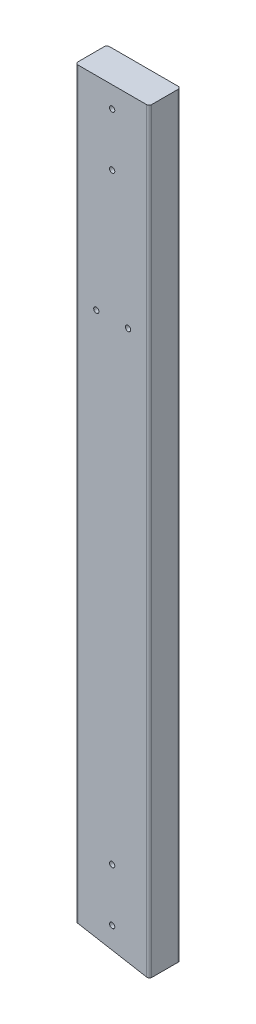
ISO-10303-21;
HEADER;
FILE_DESCRIPTION(('STEP AP214'),'2;1');
FILE_NAME('part.step','',(''),(''),'','','');
FILE_SCHEMA(('AUTOMOTIVE_DESIGN { 1 0 10303 214 1 1 1 1 }'));
ENDSEC;
DATA;
#1=APPLICATION_CONTEXT('core data for automotive mechanical design processes');
#2=APPLICATION_PROTOCOL_DEFINITION('international standard','automotive_design',2000,#1);
#3=PRODUCT_CONTEXT('',#1,'mechanical');
#4=PRODUCT('Part','Part','',(#3));
#5=PRODUCT_RELATED_PRODUCT_CATEGORY('part','',(#4));
#6=PRODUCT_DEFINITION_FORMATION('','',#4);
#7=PRODUCT_DEFINITION_CONTEXT('part definition',#1,'design');
#8=PRODUCT_DEFINITION('design','',#6,#7);
#9=PRODUCT_DEFINITION_SHAPE('','',#8);
#10=(LENGTH_UNIT() NAMED_UNIT(*) SI_UNIT(.MILLI.,.METRE.));
#11=(NAMED_UNIT(*) PLANE_ANGLE_UNIT() SI_UNIT($,.RADIAN.));
#12=(NAMED_UNIT(*) SI_UNIT($,.STERADIAN.) SOLID_ANGLE_UNIT());
#13=UNCERTAINTY_MEASURE_WITH_UNIT(LENGTH_MEASURE(1.E-05),#10,'distance_accuracy_value','');
#14=(GEOMETRIC_REPRESENTATION_CONTEXT(3) GLOBAL_UNCERTAINTY_ASSIGNED_CONTEXT((#13)) GLOBAL_UNIT_ASSIGNED_CONTEXT((#10,
#11,#12)) REPRESENTATION_CONTEXT('',''));
#15=CARTESIAN_POINT('',(0.,0.,0.));
#16=DIRECTION('',(0.,0.,1.));
#17=DIRECTION('',(1.,0.,0.));
#18=AXIS2_PLACEMENT_3D('',#15,#16,#17);
#19=CARTESIAN_POINT('',(-44.45,909.6375,-19.05));
#20=DIRECTION('',(1.,0.,0.));
#21=DIRECTION('',(0.,0.,-1.));
#22=AXIS2_PLACEMENT_3D('',#19,#20,#21);
#23=PLANE('',#22);
#24=DIRECTION('',(0.,0.,1.));
#25=VECTOR('',#24,1.);
#26=CARTESIAN_POINT('',(-44.45,909.6375,-19.05));
#27=LINE('',#26,#25);
#28=CARTESIAN_POINT('',(-44.45,909.6375,-15.875));
#29=VERTEX_POINT('',#28);
#30=CARTESIAN_POINT('',(-44.45,909.6375,15.875));
#31=VERTEX_POINT('',#30);
#32=EDGE_CURVE('E120',#29,#31,#27,.T.);
#33=ORIENTED_EDGE('',*,*,#32,.F.);
#34=DIRECTION('',(0.,-1.,0.));
#35=VECTOR('',#34,1.);
#36=CARTESIAN_POINT('',(-44.45,909.6375,-15.875));
#37=LINE('',#36,#35);
#38=CARTESIAN_POINT('',(-44.45,15.6754685849819,-15.8750000000001));
#39=VERTEX_POINT('',#38);
#40=EDGE_CURVE('E105',#29,#39,#37,.T.);
#41=ORIENTED_EDGE('',*,*,#40,.T.);
#42=DIRECTION('',(0.,0.,1.));
#43=VECTOR('',#42,1.);
#44=CARTESIAN_POINT('',(-44.45,15.6754685849819,-1238.5867532));
#45=LINE('',#44,#43);
#46=CARTESIAN_POINT('',(-44.45,15.6754685849819,15.8750000000001));
#47=VERTEX_POINT('',#46);
#48=EDGE_CURVE('E117',#39,#47,#45,.T.);
#49=ORIENTED_EDGE('',*,*,#48,.T.);
#50=DIRECTION('',(0.,-1.,0.));
#51=VECTOR('',#50,1.);
#52=CARTESIAN_POINT('',(-44.45,909.6375,15.875));
#53=LINE('',#52,#51);
#54=EDGE_CURVE('E122',#47,#31,#53,.F.);
#55=ORIENTED_EDGE('',*,*,#54,.T.);
#56=EDGE_LOOP('',(#33,#41,#49,#55));
#57=FACE_BOUND('',#56,.T.);
#58=ADVANCED_FACE('F34',(#57),#23,.F.);
#59=CARTESIAN_POINT('',(44.45,909.6375,19.05));
#60=DIRECTION('',(0.,0.,-1.));
#61=DIRECTION('',(-1.,0.,0.));
#62=AXIS2_PLACEMENT_3D('',#59,#60,#61);
#63=PLANE('',#62);
#64=CARTESIAN_POINT('',(0.,33.6295746,19.05));
#65=DIRECTION('',(0.,0.,1.));
#66=DIRECTION('',(1.,0.,0.));
#67=AXIS2_PLACEMENT_3D('',#64,#65,#66);
#68=CIRCLE('',#67,3.17499999999999);
#69=CARTESIAN_POINT('',(3.175,33.6295746,19.05));
#70=VERTEX_POINT('',#69);
#71=EDGE_CURVE('E367',#70,#70,#68,.T.);
#72=ORIENTED_EDGE('',*,*,#71,.F.);
#73=EDGE_LOOP('',(#72));
#74=FACE_BOUND('',#73,.T.);
#75=CARTESIAN_POINT('',(0.,97.1295746,19.05));
#76=DIRECTION('',(0.,0.,1.));
#77=DIRECTION('',(1.,0.,0.));
#78=AXIS2_PLACEMENT_3D('',#75,#76,#77);
#79=CIRCLE('',#78,3.17499999999999);
#80=CARTESIAN_POINT('',(3.175,97.1295746,19.05));
#81=VERTEX_POINT('',#80);
#82=EDGE_CURVE('E363',#81,#81,#79,.T.);
#83=ORIENTED_EDGE('',*,*,#82,.F.);
#84=EDGE_LOOP('',(#83));
#85=FACE_BOUND('',#84,.T.);
#86=CARTESIAN_POINT('',(19.05,665.2279812,19.05));
#87=DIRECTION('',(0.,0.,1.));
#88=DIRECTION('',(1.,0.,0.));
#89=AXIS2_PLACEMENT_3D('',#86,#87,#88);
#90=CIRCLE('',#89,3.17499999999999);
#91=CARTESIAN_POINT('',(22.225,665.2279812,19.05));
#92=VERTEX_POINT('',#91);
#93=EDGE_CURVE('E359',#92,#92,#90,.T.);
#94=ORIENTED_EDGE('',*,*,#93,.F.);
#95=EDGE_LOOP('',(#94));
#96=FACE_BOUND('',#95,.T.);
#97=CARTESIAN_POINT('',(-19.05,665.2279812,19.05));
#98=DIRECTION('',(0.,0.,1.));
#99=DIRECTION('',(1.,0.,0.));
#100=AXIS2_PLACEMENT_3D('',#97,#98,#99);
#101=CIRCLE('',#100,3.17499999999999);
#102=CARTESIAN_POINT('',(-15.875,665.2279812,19.05));
#103=VERTEX_POINT('',#102);
#104=EDGE_CURVE('E355',#103,#103,#101,.T.);
#105=ORIENTED_EDGE('',*,*,#104,.F.);
#106=EDGE_LOOP('',(#105));
#107=FACE_BOUND('',#106,.T.);
#108=CARTESIAN_POINT('',(0.,820.7375,19.05));
#109=DIRECTION('',(0.,0.,1.));
#110=DIRECTION('',(1.,0.,0.));
#111=AXIS2_PLACEMENT_3D('',#108,#109,#110);
#112=CIRCLE('',#111,3.17499999999999);
#113=CARTESIAN_POINT('',(3.17499999999999,820.7375,19.05));
#114=VERTEX_POINT('',#113);
#115=EDGE_CURVE('E351',#114,#114,#112,.T.);
#116=ORIENTED_EDGE('',*,*,#115,.F.);
#117=EDGE_LOOP('',(#116));
#118=FACE_BOUND('',#117,.T.);
#119=CARTESIAN_POINT('',(0.,884.2375,19.05));
#120=DIRECTION('',(0.,0.,1.));
#121=DIRECTION('',(1.,0.,0.));
#122=AXIS2_PLACEMENT_3D('',#119,#120,#121);
#123=CIRCLE('',#122,3.17499999999999);
#124=CARTESIAN_POINT('',(3.17499999999999,884.2375,19.05));
#125=VERTEX_POINT('',#124);
#126=EDGE_CURVE('E346',#125,#125,#123,.T.);
#127=ORIENTED_EDGE('',*,*,#126,.F.);
#128=EDGE_LOOP('',(#127));
#129=FACE_BOUND('',#128,.T.);
#130=DIRECTION('',(1.,0.,0.));
#131=VECTOR('',#130,1.);
#132=CARTESIAN_POINT('',(44.45,909.6375,19.05));
#133=LINE('',#132,#131);
#134=CARTESIAN_POINT('',(-41.275,909.6375,19.05));
#135=VERTEX_POINT('',#134);
#136=CARTESIAN_POINT('',(41.275,909.6375,19.05));
#137=VERTEX_POINT('',#136);
#138=EDGE_CURVE('E137',#135,#137,#133,.T.);
#139=ORIENTED_EDGE('',*,*,#138,.F.);
#140=DIRECTION('',(0.,-1.,0.));
#141=VECTOR('',#140,1.);
#142=CARTESIAN_POINT('',(-41.275,909.6375,19.05));
#143=LINE('',#142,#141);
#144=CARTESIAN_POINT('',(-41.275,15.1156304212326,19.05));
#145=VERTEX_POINT('',#144);
#146=EDGE_CURVE('E11',#135,#145,#143,.T.);
#147=ORIENTED_EDGE('',*,*,#146,.T.);
#148=DIRECTION('',(-0.984807753012209,0.173648177666924,0.));
#149=VECTOR('',#148,1.);
#150=CARTESIAN_POINT('',(44.45,0.,19.05));
#151=LINE('',#150,#149);
#152=CARTESIAN_POINT('',(41.275,0.559838163749354,19.05));
#153=VERTEX_POINT('',#152);
#154=EDGE_CURVE('E128',#153,#145,#151,.T.);
#155=ORIENTED_EDGE('',*,*,#154,.F.);
#156=DIRECTION('',(0.,-1.,0.));
#157=VECTOR('',#156,1.);
#158=CARTESIAN_POINT('',(41.275,909.6375,19.05));
#159=LINE('',#158,#157);
#160=EDGE_CURVE('E42',#153,#137,#159,.F.);
#161=ORIENTED_EDGE('',*,*,#160,.T.);
#162=EDGE_LOOP('',(#139,#147,#155,#161));
#163=FACE_BOUND('',#162,.T.);
#164=ADVANCED_FACE('F166',(#74,#85,#96,#107,#118,#129,#163),#63,.F.);
#165=CARTESIAN_POINT('',(44.45,909.6375,-19.05));
#166=DIRECTION('',(-1.,0.,0.));
#167=DIRECTION('',(0.,0.,1.));
#168=AXIS2_PLACEMENT_3D('',#165,#166,#167);
#169=PLANE('',#168);
#170=DIRECTION('',(0.,0.,-1.));
#171=VECTOR('',#170,1.);
#172=CARTESIAN_POINT('',(44.45,0.,-19.05));
#173=LINE('',#172,#171);
#174=CARTESIAN_POINT('',(44.45,0.,15.875));
#175=VERTEX_POINT('',#174);
#176=CARTESIAN_POINT('',(44.45,0.,-15.875));
#177=VERTEX_POINT('',#176);
#178=EDGE_CURVE('E130',#175,#177,#173,.T.);
#179=ORIENTED_EDGE('',*,*,#178,.T.);
#180=DIRECTION('',(0.,-1.,0.));
#181=VECTOR('',#180,1.);
#182=CARTESIAN_POINT('',(44.45,909.6375,-15.875));
#183=LINE('',#182,#181);
#184=CARTESIAN_POINT('',(44.45,909.6375,-15.875));
#185=VERTEX_POINT('',#184);
#186=EDGE_CURVE('E49',#177,#185,#183,.F.);
#187=ORIENTED_EDGE('',*,*,#186,.T.);
#188=DIRECTION('',(0.,0.,-1.));
#189=VECTOR('',#188,1.);
#190=CARTESIAN_POINT('',(44.45,909.6375,-19.05));
#191=LINE('',#190,#189);
#192=CARTESIAN_POINT('',(44.45,909.6375,15.875));
#193=VERTEX_POINT('',#192);
#194=EDGE_CURVE('E139',#193,#185,#191,.T.);
#195=ORIENTED_EDGE('',*,*,#194,.F.);
#196=DIRECTION('',(0.,-1.,0.));
#197=VECTOR('',#196,1.);
#198=CARTESIAN_POINT('',(44.45,909.6375,15.875));
#199=LINE('',#198,#197);
#200=EDGE_CURVE('E159',#193,#175,#199,.T.);
#201=ORIENTED_EDGE('',*,*,#200,.T.);
#202=EDGE_LOOP('',(#179,#187,#195,#201));
#203=FACE_BOUND('',#202,.T.);
#204=ADVANCED_FACE('F173',(#203),#169,.F.);
#205=CARTESIAN_POINT('',(44.45,909.6375,-19.05));
#206=DIRECTION('',(0.,0.,1.));
#207=DIRECTION('',(1.,0.,0.));
#208=AXIS2_PLACEMENT_3D('',#205,#206,#207);
#209=PLANE('',#208);
#210=CARTESIAN_POINT('',(0.,33.6295746,-19.05));
#211=DIRECTION('',(0.,0.,1.));
#212=DIRECTION('',(1.,0.,0.));
#213=AXIS2_PLACEMENT_3D('',#210,#211,#212);
#214=CIRCLE('',#213,3.17499999999998);
#215=CARTESIAN_POINT('',(3.17499999999999,33.6295746,-19.05));
#216=VERTEX_POINT('',#215);
#217=EDGE_CURVE('E327',#216,#216,#214,.T.);
#218=ORIENTED_EDGE('',*,*,#217,.T.);
#219=EDGE_LOOP('',(#218));
#220=FACE_BOUND('',#219,.T.);
#221=CARTESIAN_POINT('',(0.,97.1295746,-19.05));
#222=DIRECTION('',(0.,0.,1.));
#223=DIRECTION('',(1.,0.,0.));
#224=AXIS2_PLACEMENT_3D('',#221,#222,#223);
#225=CIRCLE('',#224,3.17499999999998);
#226=CARTESIAN_POINT('',(3.17499999999999,97.1295746,-19.05));
#227=VERTEX_POINT('',#226);
#228=EDGE_CURVE('E331',#227,#227,#225,.T.);
#229=ORIENTED_EDGE('',*,*,#228,.T.);
#230=EDGE_LOOP('',(#229));
#231=FACE_BOUND('',#230,.T.);
#232=CARTESIAN_POINT('',(19.05,665.2279812,-19.05));
#233=DIRECTION('',(0.,0.,1.));
#234=DIRECTION('',(1.,0.,0.));
#235=AXIS2_PLACEMENT_3D('',#232,#233,#234);
#236=CIRCLE('',#235,3.17499999999998);
#237=CARTESIAN_POINT('',(22.225,665.2279812,-19.05));
#238=VERTEX_POINT('',#237);
#239=EDGE_CURVE('E335',#238,#238,#236,.T.);
#240=ORIENTED_EDGE('',*,*,#239,.T.);
#241=EDGE_LOOP('',(#240));
#242=FACE_BOUND('',#241,.T.);
#243=CARTESIAN_POINT('',(-19.05,665.2279812,-19.05));
#244=DIRECTION('',(0.,0.,1.));
#245=DIRECTION('',(1.,0.,0.));
#246=AXIS2_PLACEMENT_3D('',#243,#244,#245);
#247=CIRCLE('',#246,3.17499999999998);
#248=CARTESIAN_POINT('',(-15.875,665.2279812,-19.05));
#249=VERTEX_POINT('',#248);
#250=EDGE_CURVE('E339',#249,#249,#247,.T.);
#251=ORIENTED_EDGE('',*,*,#250,.T.);
#252=EDGE_LOOP('',(#251));
#253=FACE_BOUND('',#252,.T.);
#254=CARTESIAN_POINT('',(0.,820.7375,-19.05));
#255=DIRECTION('',(0.,0.,1.));
#256=DIRECTION('',(1.,0.,0.));
#257=AXIS2_PLACEMENT_3D('',#254,#255,#256);
#258=CIRCLE('',#257,3.17499999999998);
#259=CARTESIAN_POINT('',(3.17499999999999,820.7375,-19.05));
#260=VERTEX_POINT('',#259);
#261=EDGE_CURVE('E343',#260,#260,#258,.T.);
#262=ORIENTED_EDGE('',*,*,#261,.T.);
#263=EDGE_LOOP('',(#262));
#264=FACE_BOUND('',#263,.T.);
#265=CARTESIAN_POINT('',(0.,884.2375,-19.05));
#266=DIRECTION('',(0.,0.,1.));
#267=DIRECTION('',(1.,0.,0.));
#268=AXIS2_PLACEMENT_3D('',#265,#266,#267);
#269=CIRCLE('',#268,3.17499999999998);
#270=CARTESIAN_POINT('',(3.17499999999999,884.2375,-19.05));
#271=VERTEX_POINT('',#270);
#272=EDGE_CURVE('E132',#271,#271,#269,.T.);
#273=ORIENTED_EDGE('',*,*,#272,.T.);
#274=EDGE_LOOP('',(#273));
#275=FACE_BOUND('',#274,.T.);
#276=DIRECTION('',(-0.984807753012209,0.173648177666924,0.));
#277=VECTOR('',#276,1.);
#278=CARTESIAN_POINT('',(-111.107174062196,27.428926829927,-19.05));
#279=LINE('',#278,#277);
#280=CARTESIAN_POINT('',(41.275,0.55983816374934,-19.05));
#281=VERTEX_POINT('',#280);
#282=CARTESIAN_POINT('',(-41.275,15.1156304212326,-19.05));
#283=VERTEX_POINT('',#282);
#284=EDGE_CURVE('E127',#281,#283,#279,.T.);
#285=ORIENTED_EDGE('',*,*,#284,.T.);
#286=DIRECTION('',(0.,-1.,0.));
#287=VECTOR('',#286,1.);
#288=CARTESIAN_POINT('',(-41.275,909.6375,-19.05));
#289=LINE('',#288,#287);
#290=CARTESIAN_POINT('',(-41.275,909.6375,-19.05));
#291=VERTEX_POINT('',#290);
#292=EDGE_CURVE('E106',#283,#291,#289,.F.);
#293=ORIENTED_EDGE('',*,*,#292,.T.);
#294=DIRECTION('',(-1.,0.,0.));
#295=VECTOR('',#294,1.);
#296=CARTESIAN_POINT('',(44.45,909.6375,-19.05));
#297=LINE('',#296,#295);
#298=CARTESIAN_POINT('',(41.275,909.6375,-19.05));
#299=VERTEX_POINT('',#298);
#300=EDGE_CURVE('E141',#299,#291,#297,.T.);
#301=ORIENTED_EDGE('',*,*,#300,.F.);
#302=DIRECTION('',(0.,-1.,0.));
#303=VECTOR('',#302,1.);
#304=CARTESIAN_POINT('',(41.275,909.6375,-19.05));
#305=LINE('',#304,#303);
#306=EDGE_CURVE('E111',#299,#281,#305,.T.);
#307=ORIENTED_EDGE('',*,*,#306,.T.);
#308=EDGE_LOOP('',(#285,#293,#301,#307));
#309=FACE_BOUND('',#308,.T.);
#310=ADVANCED_FACE('F180',(#220,#231,#242,#253,#264,#275,#309),#209,.F.);
#311=CARTESIAN_POINT('',(0.,909.6375,0.));
#312=DIRECTION('',(0.,-1.,0.));
#313=DIRECTION('',(0.,0.,-1.));
#314=AXIS2_PLACEMENT_3D('',#311,#312,#313);
#315=PLANE('',#314);
#316=ORIENTED_EDGE('',*,*,#300,.T.);
#317=CARTESIAN_POINT('',(-41.275,909.6375,-15.875));
#318=DIRECTION('',(0.,-1.,0.));
#319=DIRECTION('',(0.,0.,-1.));
#320=AXIS2_PLACEMENT_3D('',#317,#318,#319);
#321=CIRCLE('',#320,3.175);
#322=EDGE_CURVE('E157',#291,#29,#321,.F.);
#323=ORIENTED_EDGE('',*,*,#322,.T.);
#324=ORIENTED_EDGE('',*,*,#32,.T.);
#325=CARTESIAN_POINT('',(-41.275,909.6375,15.875));
#326=DIRECTION('',(0.,-1.,0.));
#327=DIRECTION('',(0.,0.,-1.));
#328=AXIS2_PLACEMENT_3D('',#325,#326,#327);
#329=CIRCLE('',#328,3.175);
#330=EDGE_CURVE('E153',#31,#135,#329,.F.);
#331=ORIENTED_EDGE('',*,*,#330,.T.);
#332=ORIENTED_EDGE('',*,*,#138,.T.);
#333=CARTESIAN_POINT('',(41.275,909.6375,15.875));
#334=DIRECTION('',(0.,-1.,0.));
#335=DIRECTION('',(0.,0.,-1.));
#336=AXIS2_PLACEMENT_3D('',#333,#334,#335);
#337=CIRCLE('',#336,3.175);
#338=EDGE_CURVE('E56',#137,#193,#337,.F.);
#339=ORIENTED_EDGE('',*,*,#338,.T.);
#340=ORIENTED_EDGE('',*,*,#194,.T.);
#341=CARTESIAN_POINT('',(41.275,909.6375,-15.875));
#342=DIRECTION('',(0.,-1.,0.));
#343=DIRECTION('',(0.,0.,-1.));
#344=AXIS2_PLACEMENT_3D('',#341,#342,#343);
#345=CIRCLE('',#344,3.175);
#346=EDGE_CURVE('E155',#185,#299,#345,.F.);
#347=ORIENTED_EDGE('',*,*,#346,.T.);
#348=EDGE_LOOP('',(#316,#323,#324,#331,#332,#339,#340,#347));
#349=FACE_BOUND('',#348,.T.);
#350=ADVANCED_FACE('F169',(#349),#315,.F.);
#351=CARTESIAN_POINT('',(44.45,0.,-1238.5867532));
#352=DIRECTION('',(0.173648177666924,0.984807753012209,0.));
#353=DIRECTION('',(-0.984807753012209,0.173648177666924,0.));
#354=AXIS2_PLACEMENT_3D('',#351,#352,#353);
#355=PLANE('',#354);
#356=ORIENTED_EDGE('',*,*,#48,.F.);
#357=CARTESIAN_POINT('',(-41.275,15.1156304212327,-15.875));
#358=DIRECTION('',(0.173648177666924,0.984807753012209,0.));
#359=DIRECTION('',(0.984807753012209,-0.173648177666924,0.));
#360=AXIS2_PLACEMENT_3D('',#357,#358,#359);
#361=ELLIPSE('',#360,3.22397949273724,3.175);
#362=EDGE_CURVE('E101',#39,#283,#361,.F.);
#363=ORIENTED_EDGE('',*,*,#362,.T.);
#364=ORIENTED_EDGE('',*,*,#284,.F.);
#365=CARTESIAN_POINT('',(41.275,0.559838163749382,-15.875));
#366=DIRECTION('',(0.173648177666924,0.984807753012209,0.));
#367=DIRECTION('',(0.984807753012209,-0.173648177666924,0.));
#368=AXIS2_PLACEMENT_3D('',#365,#366,#367);
#369=ELLIPSE('',#368,3.22397949273724,3.175);
#370=EDGE_CURVE('E112',#281,#177,#369,.F.);
#371=ORIENTED_EDGE('',*,*,#370,.T.);
#372=ORIENTED_EDGE('',*,*,#178,.F.);
#373=CARTESIAN_POINT('',(41.275,0.559838163749382,15.875));
#374=DIRECTION('',(0.173648177666924,0.984807753012209,0.));
#375=DIRECTION('',(0.984807753012209,-0.173648177666924,0.));
#376=AXIS2_PLACEMENT_3D('',#373,#374,#375);
#377=ELLIPSE('',#376,3.22397949273724,3.175);
#378=EDGE_CURVE('E121',#175,#153,#377,.F.);
#379=ORIENTED_EDGE('',*,*,#378,.T.);
#380=ORIENTED_EDGE('',*,*,#154,.T.);
#381=CARTESIAN_POINT('',(-41.275,15.1156304212327,15.875));
#382=DIRECTION('',(0.173648177666924,0.984807753012209,0.));
#383=DIRECTION('',(0.984807753012209,-0.173648177666924,0.));
#384=AXIS2_PLACEMENT_3D('',#381,#382,#383);
#385=ELLIPSE('',#384,3.22397949273724,3.175);
#386=EDGE_CURVE('E126',#145,#47,#385,.F.);
#387=ORIENTED_EDGE('',*,*,#386,.T.);
#388=EDGE_LOOP('',(#356,#363,#364,#371,#372,#379,#380,#387));
#389=FACE_BOUND('',#388,.T.);
#390=ADVANCED_FACE('F124',(#389),#355,.F.);
#391=CARTESIAN_POINT('',(0.,884.2375,19.05));
#392=DIRECTION('',(0.,0.,1.));
#393=DIRECTION('',(1.,0.,0.));
#394=AXIS2_PLACEMENT_3D('',#391,#392,#393);
#395=CYLINDRICAL_SURFACE('',#394,3.17499999999999);
#396=ORIENTED_EDGE('',*,*,#272,.F.);
#397=EDGE_LOOP('',(#396));
#398=FACE_BOUND('',#397,.T.);
#399=ORIENTED_EDGE('',*,*,#126,.T.);
#400=EDGE_LOOP('',(#399));
#401=FACE_BOUND('',#400,.T.);
#402=ADVANCED_FACE('F225',(#398,#401),#395,.F.);
#403=CARTESIAN_POINT('',(0.,820.7375,19.05));
#404=DIRECTION('',(0.,0.,1.));
#405=DIRECTION('',(1.,0.,0.));
#406=AXIS2_PLACEMENT_3D('',#403,#404,#405);
#407=CYLINDRICAL_SURFACE('',#406,3.17499999999999);
#408=ORIENTED_EDGE('',*,*,#261,.F.);
#409=EDGE_LOOP('',(#408));
#410=FACE_BOUND('',#409,.T.);
#411=ORIENTED_EDGE('',*,*,#115,.T.);
#412=EDGE_LOOP('',(#411));
#413=FACE_BOUND('',#412,.T.);
#414=ADVANCED_FACE('F221',(#410,#413),#407,.F.);
#415=CARTESIAN_POINT('',(-19.05,665.2279812,19.05));
#416=DIRECTION('',(0.,0.,1.));
#417=DIRECTION('',(1.,0.,0.));
#418=AXIS2_PLACEMENT_3D('',#415,#416,#417);
#419=CYLINDRICAL_SURFACE('',#418,3.17499999999999);
#420=ORIENTED_EDGE('',*,*,#250,.F.);
#421=EDGE_LOOP('',(#420));
#422=FACE_BOUND('',#421,.T.);
#423=ORIENTED_EDGE('',*,*,#104,.T.);
#424=EDGE_LOOP('',(#423));
#425=FACE_BOUND('',#424,.T.);
#426=ADVANCED_FACE('F217',(#422,#425),#419,.F.);
#427=CARTESIAN_POINT('',(19.05,665.2279812,19.05));
#428=DIRECTION('',(0.,0.,1.));
#429=DIRECTION('',(1.,0.,0.));
#430=AXIS2_PLACEMENT_3D('',#427,#428,#429);
#431=CYLINDRICAL_SURFACE('',#430,3.17499999999999);
#432=ORIENTED_EDGE('',*,*,#239,.F.);
#433=EDGE_LOOP('',(#432));
#434=FACE_BOUND('',#433,.T.);
#435=ORIENTED_EDGE('',*,*,#93,.T.);
#436=EDGE_LOOP('',(#435));
#437=FACE_BOUND('',#436,.T.);
#438=ADVANCED_FACE('F209',(#434,#437),#431,.F.);
#439=CARTESIAN_POINT('',(0.,97.1295746,19.05));
#440=DIRECTION('',(0.,0.,1.));
#441=DIRECTION('',(1.,0.,0.));
#442=AXIS2_PLACEMENT_3D('',#439,#440,#441);
#443=CYLINDRICAL_SURFACE('',#442,3.17499999999999);
#444=ORIENTED_EDGE('',*,*,#228,.F.);
#445=EDGE_LOOP('',(#444));
#446=FACE_BOUND('',#445,.T.);
#447=ORIENTED_EDGE('',*,*,#82,.T.);
#448=EDGE_LOOP('',(#447));
#449=FACE_BOUND('',#448,.T.);
#450=ADVANCED_FACE('F203',(#446,#449),#443,.F.);
#451=CARTESIAN_POINT('',(0.,33.6295746,19.05));
#452=DIRECTION('',(0.,0.,1.));
#453=DIRECTION('',(1.,0.,0.));
#454=AXIS2_PLACEMENT_3D('',#451,#452,#453);
#455=CYLINDRICAL_SURFACE('',#454,3.17499999999999);
#456=ORIENTED_EDGE('',*,*,#217,.F.);
#457=EDGE_LOOP('',(#456));
#458=FACE_BOUND('',#457,.T.);
#459=ORIENTED_EDGE('',*,*,#71,.T.);
#460=EDGE_LOOP('',(#459));
#461=FACE_BOUND('',#460,.T.);
#462=ADVANCED_FACE('F199',(#458,#461),#455,.F.);
#463=CARTESIAN_POINT('',(-41.275,909.6375,-15.875));
#464=DIRECTION('',(0.,-1.,0.));
#465=DIRECTION('',(0.,0.,-1.));
#466=AXIS2_PLACEMENT_3D('',#463,#464,#465);
#467=CYLINDRICAL_SURFACE('',#466,3.175);
#468=ORIENTED_EDGE('',*,*,#322,.F.);
#469=ORIENTED_EDGE('',*,*,#292,.F.);
#470=ORIENTED_EDGE('',*,*,#362,.F.);
#471=ORIENTED_EDGE('',*,*,#40,.F.);
#472=EDGE_LOOP('',(#468,#469,#470,#471));
#473=FACE_BOUND('',#472,.T.);
#474=ADVANCED_FACE('F104',(#473),#467,.T.);
#475=CARTESIAN_POINT('',(41.275,909.6375,-15.875));
#476=DIRECTION('',(0.,-1.,0.));
#477=DIRECTION('',(0.,0.,-1.));
#478=AXIS2_PLACEMENT_3D('',#475,#476,#477);
#479=CYLINDRICAL_SURFACE('',#478,3.175);
#480=ORIENTED_EDGE('',*,*,#346,.F.);
#481=ORIENTED_EDGE('',*,*,#186,.F.);
#482=ORIENTED_EDGE('',*,*,#370,.F.);
#483=ORIENTED_EDGE('',*,*,#306,.F.);
#484=EDGE_LOOP('',(#480,#481,#482,#483));
#485=FACE_BOUND('',#484,.T.);
#486=ADVANCED_FACE('F177',(#485),#479,.T.);
#487=CARTESIAN_POINT('',(-41.275,909.6375,15.875));
#488=DIRECTION('',(0.,-1.,0.));
#489=DIRECTION('',(0.,0.,-1.));
#490=AXIS2_PLACEMENT_3D('',#487,#488,#489);
#491=CYLINDRICAL_SURFACE('',#490,3.175);
#492=ORIENTED_EDGE('',*,*,#330,.F.);
#493=ORIENTED_EDGE('',*,*,#54,.F.);
#494=ORIENTED_EDGE('',*,*,#386,.F.);
#495=ORIENTED_EDGE('',*,*,#146,.F.);
#496=EDGE_LOOP('',(#492,#493,#494,#495));
#497=FACE_BOUND('',#496,.T.);
#498=ADVANCED_FACE('F182',(#497),#491,.T.);
#499=CARTESIAN_POINT('',(41.275,909.6375,15.875));
#500=DIRECTION('',(0.,-1.,0.));
#501=DIRECTION('',(0.,0.,-1.));
#502=AXIS2_PLACEMENT_3D('',#499,#500,#501);
#503=CYLINDRICAL_SURFACE('',#502,3.175);
#504=ORIENTED_EDGE('',*,*,#338,.F.);
#505=ORIENTED_EDGE('',*,*,#160,.F.);
#506=ORIENTED_EDGE('',*,*,#378,.F.);
#507=ORIENTED_EDGE('',*,*,#200,.F.);
#508=EDGE_LOOP('',(#504,#505,#506,#507));
#509=FACE_BOUND('',#508,.T.);
#510=ADVANCED_FACE('F36',(#509),#503,.T.);
#511=CLOSED_SHELL('',(#58,#164,#204,#310,#350,#390,#402,#414,#426,#438,#450,#462,#474,#486,#498,#510));
#512=MANIFOLD_SOLID_BREP('B2',#511);
#513=ADVANCED_BREP_SHAPE_REPRESENTATION('',(#18,#512),#14);
#514=SHAPE_DEFINITION_REPRESENTATION(#9,#513);
ENDSEC;
END-ISO-10303-21;
